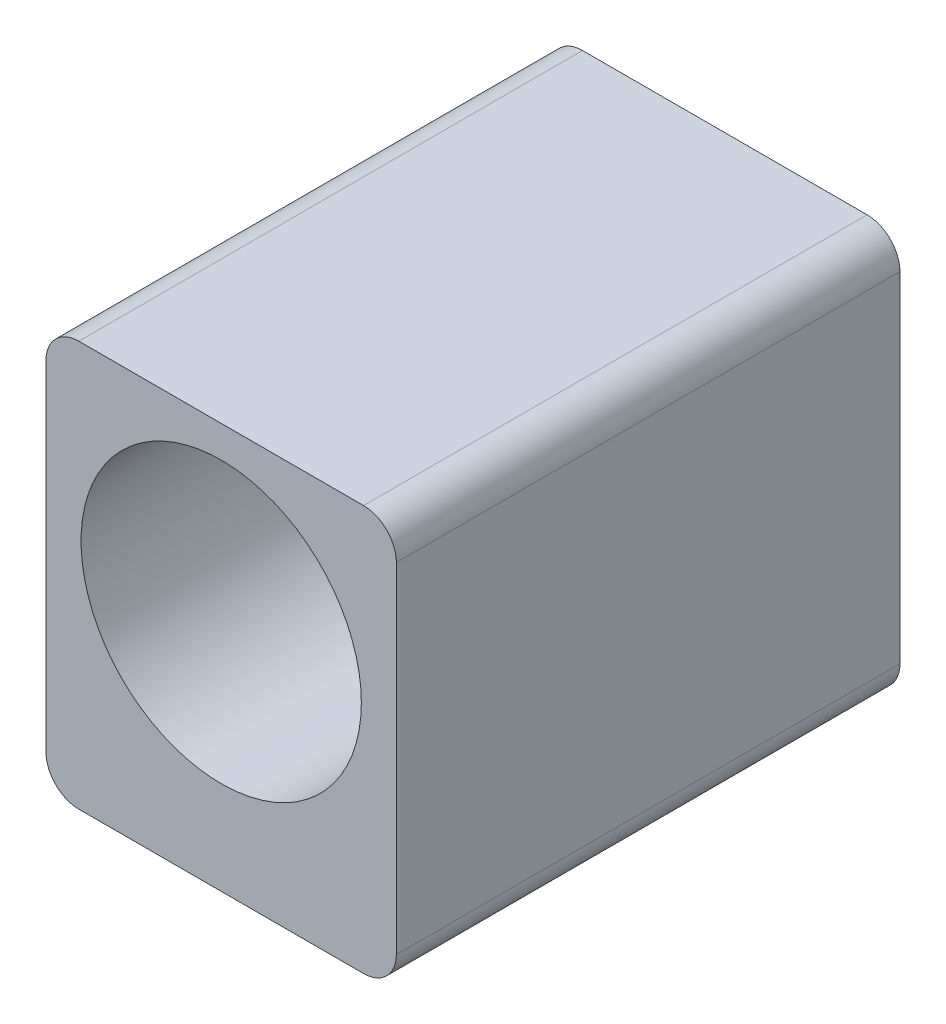
ISO-10303-21;
HEADER;
FILE_DESCRIPTION(('STEP AP214'),'2;1');
FILE_NAME('part.step','',(''),(''),'','','');
FILE_SCHEMA(('AUTOMOTIVE_DESIGN { 1 0 10303 214 1 1 1 1 }'));
ENDSEC;
DATA;
#1=APPLICATION_CONTEXT('core data for automotive mechanical design processes');
#2=APPLICATION_PROTOCOL_DEFINITION('international standard','automotive_design',2000,#1);
#3=PRODUCT_CONTEXT('',#1,'mechanical');
#4=PRODUCT('Part','Part','',(#3));
#5=PRODUCT_RELATED_PRODUCT_CATEGORY('part','',(#4));
#6=PRODUCT_DEFINITION_FORMATION('','',#4);
#7=PRODUCT_DEFINITION_CONTEXT('part definition',#1,'design');
#8=PRODUCT_DEFINITION('design','',#6,#7);
#9=PRODUCT_DEFINITION_SHAPE('','',#8);
#10=(LENGTH_UNIT() NAMED_UNIT(*) SI_UNIT(.MILLI.,.METRE.));
#11=(NAMED_UNIT(*) PLANE_ANGLE_UNIT() SI_UNIT($,.RADIAN.));
#12=(NAMED_UNIT(*) SI_UNIT($,.STERADIAN.) SOLID_ANGLE_UNIT());
#13=UNCERTAINTY_MEASURE_WITH_UNIT(LENGTH_MEASURE(1.E-05),#10,'distance_accuracy_value','');
#14=(GEOMETRIC_REPRESENTATION_CONTEXT(3) GLOBAL_UNCERTAINTY_ASSIGNED_CONTEXT((#13)) GLOBAL_UNIT_ASSIGNED_CONTEXT((#10,
#11,#12)) REPRESENTATION_CONTEXT('',''));
#15=CARTESIAN_POINT('',(0.,0.,0.));
#16=DIRECTION('',(0.,0.,1.));
#17=DIRECTION('',(1.,0.,0.));
#18=AXIS2_PLACEMENT_3D('',#15,#16,#17);
#19=CARTESIAN_POINT('',(-13.,-18.319,23.));
#20=DIRECTION('',(0.,0.,-1.));
#21=DIRECTION('',(-1.,0.,0.));
#22=AXIS2_PLACEMENT_3D('',#19,#20,#21);
#23=CYLINDRICAL_SURFACE('',#22,3.);
#24=CARTESIAN_POINT('',(-13.,-21.319,-15.7679491924311));
#25=CARTESIAN_POINT('',(-13.0476495419929,-21.319003246879,-15.7954566866554));
#26=CARTESIAN_POINT('',(-13.0941261367706,-21.3178644153685,-15.8249157263393));
#27=CARTESIAN_POINT('',(-13.1844127345255,-21.3136667729227,-15.887492356479));
#28=CARTESIAN_POINT('',(-13.2282244852853,-21.3106092356276,-15.9206075079945));
#29=CARTESIAN_POINT('',(-13.354971994891,-21.2991289054113,-16.0248805220334));
#30=CARTESIAN_POINT('',(-13.4335644856848,-21.2883931901029,-16.1011657594107));
#31=CARTESIAN_POINT('',(-13.5768998394832,-21.2639082719283,-16.2649958822506));
#32=CARTESIAN_POINT('',(-13.641668387287,-21.250164755528,-16.3525193936037));
#33=CARTESIAN_POINT('',(-13.7562389302473,-21.2227178611149,-16.5369769090204));
#34=CARTESIAN_POINT('',(-13.8060301014096,-21.2090145191842,-16.633917652206));
#35=CARTESIAN_POINT('',(-13.8910629780802,-21.1839728605559,-16.8391498105373));
#36=CARTESIAN_POINT('',(-13.9256094605519,-21.1727573558681,-16.9477463151311));
#37=CARTESIAN_POINT('',(-13.9757945271664,-21.1559950421372,-17.1696173248816));
#38=CARTESIAN_POINT('',(-13.9914448364848,-21.1504447181504,-17.2828888839642));
#39=CARTESIAN_POINT('',(-14.0029639822057,-21.146383235086,-17.5056348392102));
#40=CARTESIAN_POINT('',(-13.999659217434,-21.1475779698607,-17.6150615404273));
#41=CARTESIAN_POINT('',(-13.9753162540335,-21.1560616133414,-17.8316710432726));
#42=CARTESIAN_POINT('',(-13.9542775064692,-21.1633507106914,-17.9388537753359));
#43=CARTESIAN_POINT('',(-13.8958183231178,-21.1822885845804,-18.145934761301));
#44=CARTESIAN_POINT('',(-13.8587245744734,-21.1938497797202,-18.2459341696921));
#45=CARTESIAN_POINT('',(-13.7692513439552,-21.2190696496689,-18.4386401815987));
#46=CARTESIAN_POINT('',(-13.7168589366862,-21.2327300934301,-18.5313405339215));
#47=CARTESIAN_POINT('',(-13.5946245265132,-21.2601843484393,-18.7123427309295));
#48=CARTESIAN_POINT('',(-13.5239601372463,-21.273941628559,-18.8000953033822));
#49=CARTESIAN_POINT('',(-13.3686421667565,-21.2972920015662,-18.9626663833322));
#50=CARTESIAN_POINT('',(-13.2840209392891,-21.3068945433787,-19.0375140040651));
#51=CARTESIAN_POINT('',(-13.162652445956,-21.3147496086829,-19.1278026107539));
#52=CARTESIAN_POINT('',(-13.1309719735022,-21.3163143003361,-19.1499699645611));
#53=CARTESIAN_POINT('',(-13.0663859430122,-21.3184389764101,-19.1924271085756));
#54=CARTESIAN_POINT('',(-13.0334815120283,-21.3189998628735,-19.212718568935));
#55=CARTESIAN_POINT('',(-13.,-21.319,-19.2320508075689));
#56=B_SPLINE_CURVE_WITH_KNOTS('',3,(#24,#25,#26,#27,#28,#29,#30,#31,#32,#33,#34,#35,#36,#37,#38,
#39,#40,#41,#42,#43,#44,#45,#46,#47,#48,#49,#50,#51,#52,#53,#54,#55),.UNSPECIFIED.,.F.,.F.,(4,2,
2,2,2,2,2,2,2,2,2,2,2,2,2,4),(0.,0.164928355044265,0.329747346002017,0.658207068340202,
0.986051097141595,1.31413148930953,1.65592666310572,1.9975096420087,2.32431683994227,
2.65113415419674,2.97159288998393,3.29232315937776,3.63127871423117,3.96945929389357,
4.08549092620192,4.20141823735249),.UNSPECIFIED.);
#57=CARTESIAN_POINT('',(-13.,-21.319,-15.7679491924311));
#58=VERTEX_POINT('',#57);
#59=CARTESIAN_POINT('',(-13.,-21.319,-19.2320508075689));
#60=VERTEX_POINT('',#59);
#61=EDGE_CURVE('E52',#58,#60,#56,.T.);
#62=ORIENTED_EDGE('',*,*,#61,.F.);
#63=DIRECTION('',(0.,0.,-1.));
#64=VECTOR('',#63,1.);
#65=CARTESIAN_POINT('',(-13.,-21.319,23.));
#66=LINE('',#65,#64);
#67=CARTESIAN_POINT('',(-13.,-21.319,23.));
#68=VERTEX_POINT('',#67);
#69=EDGE_CURVE('E116',#68,#58,#66,.T.);
#70=ORIENTED_EDGE('',*,*,#69,.F.);
#71=CARTESIAN_POINT('',(-13.,-18.319,23.));
#72=DIRECTION('',(0.,0.,1.));
#73=DIRECTION('',(1.,0.,0.));
#74=AXIS2_PLACEMENT_3D('',#71,#72,#73);
#75=CIRCLE('',#74,3.);
#76=CARTESIAN_POINT('',(-16.,-18.319,23.));
#77=VERTEX_POINT('',#76);
#78=EDGE_CURVE('E173',#77,#68,#75,.T.);
#79=ORIENTED_EDGE('',*,*,#78,.F.);
#80=DIRECTION('',(0.,0.,-1.));
#81=VECTOR('',#80,1.);
#82=CARTESIAN_POINT('',(-16.,-18.319,23.));
#83=LINE('',#82,#81);
#84=CARTESIAN_POINT('',(-16.,-18.319,-23.));
#85=VERTEX_POINT('',#84);
#86=EDGE_CURVE('E190',#77,#85,#83,.T.);
#87=ORIENTED_EDGE('',*,*,#86,.T.);
#88=CARTESIAN_POINT('',(-13.,-18.319,-23.));
#89=DIRECTION('',(0.,0.,1.));
#90=DIRECTION('',(1.,0.,0.));
#91=AXIS2_PLACEMENT_3D('',#88,#89,#90);
#92=CIRCLE('',#91,3.);
#93=CARTESIAN_POINT('',(-13.,-21.319,-23.));
#94=VERTEX_POINT('',#93);
#95=EDGE_CURVE('E170',#85,#94,#92,.T.);
#96=ORIENTED_EDGE('',*,*,#95,.T.);
#97=EDGE_CURVE('E130',#60,#94,#66,.T.);
#98=ORIENTED_EDGE('',*,*,#97,.F.);
#99=EDGE_LOOP('',(#62,#70,#79,#87,#96,#98));
#100=FACE_BOUND('',#99,.T.);
#101=ADVANCED_FACE('F39',(#100),#23,.T.);
#102=CARTESIAN_POINT('',(13.,-18.319,23.));
#103=DIRECTION('',(0.,0.,-1.));
#104=DIRECTION('',(-1.,0.,0.));
#105=AXIS2_PLACEMENT_3D('',#102,#103,#104);
#106=CYLINDRICAL_SURFACE('',#105,3.);
#107=CARTESIAN_POINT('',(13.,-21.319,15.7679491924311));
#108=CARTESIAN_POINT('',(13.0476495419929,-21.319003246879,15.7954566866554));
#109=CARTESIAN_POINT('',(13.0941261367706,-21.3178644153685,15.8249157263393));
#110=CARTESIAN_POINT('',(13.1844127345255,-21.3136667729227,15.887492356479));
#111=CARTESIAN_POINT('',(13.2282244852853,-21.3106092356276,15.9206075079945));
#112=CARTESIAN_POINT('',(13.354971994891,-21.2991289054113,16.0248805220334));
#113=CARTESIAN_POINT('',(13.4335644856848,-21.2883931901029,16.1011657594107));
#114=CARTESIAN_POINT('',(13.5768998394832,-21.2639082719283,16.2649958822506));
#115=CARTESIAN_POINT('',(13.641668387287,-21.250164755528,16.3525193936037));
#116=CARTESIAN_POINT('',(13.7562389302473,-21.2227178611149,16.5369769090204));
#117=CARTESIAN_POINT('',(13.8060301014096,-21.2090145191842,16.633917652206));
#118=CARTESIAN_POINT('',(13.8910629780802,-21.1839728605559,16.8391498105373));
#119=CARTESIAN_POINT('',(13.9256094605519,-21.1727573558681,16.9477463151311));
#120=CARTESIAN_POINT('',(13.9757945271664,-21.1559950421372,17.1696173248816));
#121=CARTESIAN_POINT('',(13.9914448364848,-21.1504447181504,17.2828888839642));
#122=CARTESIAN_POINT('',(14.0029639822057,-21.146383235086,17.5056348392102));
#123=CARTESIAN_POINT('',(13.999659217434,-21.1475779698607,17.6150615404273));
#124=CARTESIAN_POINT('',(13.9753162540335,-21.1560616133414,17.8316710432726));
#125=CARTESIAN_POINT('',(13.9542775064692,-21.1633507106914,17.9388537753359));
#126=CARTESIAN_POINT('',(13.8958183231178,-21.1822885845804,18.145934761301));
#127=CARTESIAN_POINT('',(13.8587245744734,-21.1938497797202,18.2459341696921));
#128=CARTESIAN_POINT('',(13.7692513439552,-21.2190696496689,18.4386401815987));
#129=CARTESIAN_POINT('',(13.7168589366862,-21.2327300934301,18.5313405339215));
#130=CARTESIAN_POINT('',(13.5946245265132,-21.2601843484393,18.7123427309295));
#131=CARTESIAN_POINT('',(13.5239601372463,-21.273941628559,18.8000953033822));
#132=CARTESIAN_POINT('',(13.3686421667565,-21.2972920015662,18.9626663833322));
#133=CARTESIAN_POINT('',(13.2840209392891,-21.3068945433787,19.0375140040651));
#134=CARTESIAN_POINT('',(13.162652445956,-21.3147496086829,19.1278026107539));
#135=CARTESIAN_POINT('',(13.1309719735022,-21.3163143003361,19.1499699645611));
#136=CARTESIAN_POINT('',(13.0663859430122,-21.3184389764101,19.1924271085756));
#137=CARTESIAN_POINT('',(13.0334815120283,-21.3189998628735,19.212718568935));
#138=CARTESIAN_POINT('',(13.,-21.319,19.2320508075689));
#139=B_SPLINE_CURVE_WITH_KNOTS('',3,(#107,#108,#109,#110,#111,#112,#113,#114,#115,#116,#117,
#118,#119,#120,#121,#122,#123,#124,#125,#126,#127,#128,#129,#130,#131,#132,#133,#134,#135,#136,
#137,#138),.UNSPECIFIED.,.F.,.F.,(4,2,2,2,2,2,2,2,2,2,2,2,2,2,2,4),(0.,0.164928355044265,
0.329747346002017,0.658207068340202,0.986051097141595,1.31413148930953,1.65592666310572,
1.9975096420087,2.32431683994227,2.65113415419674,2.97159288998393,3.29232315937776,
3.63127871423117,3.96945929389357,4.08549092620192,4.20141823735249),.UNSPECIFIED.);
#140=CARTESIAN_POINT('',(13.,-21.319,15.7679491924311));
#141=VERTEX_POINT('',#140);
#142=CARTESIAN_POINT('',(13.,-21.319,19.2320508075689));
#143=VERTEX_POINT('',#142);
#144=EDGE_CURVE('E47',#141,#143,#139,.T.);
#145=ORIENTED_EDGE('',*,*,#144,.F.);
#146=DIRECTION('',(0.,0.,-1.));
#147=VECTOR('',#146,1.);
#148=CARTESIAN_POINT('',(13.,-21.319,23.));
#149=LINE('',#148,#147);
#150=CARTESIAN_POINT('',(13.,-21.319,-23.));
#151=VERTEX_POINT('',#150);
#152=EDGE_CURVE('E123',#141,#151,#149,.T.);
#153=ORIENTED_EDGE('',*,*,#152,.T.);
#154=CARTESIAN_POINT('',(13.,-18.319,-23.));
#155=DIRECTION('',(0.,0.,1.));
#156=DIRECTION('',(1.,0.,0.));
#157=AXIS2_PLACEMENT_3D('',#154,#155,#156);
#158=CIRCLE('',#157,3.);
#159=CARTESIAN_POINT('',(16.,-18.319,-23.));
#160=VERTEX_POINT('',#159);
#161=EDGE_CURVE('E195',#151,#160,#158,.T.);
#162=ORIENTED_EDGE('',*,*,#161,.T.);
#163=DIRECTION('',(0.,0.,-1.));
#164=VECTOR('',#163,1.);
#165=CARTESIAN_POINT('',(16.,-18.319,23.));
#166=LINE('',#165,#164);
#167=CARTESIAN_POINT('',(16.,-18.319,23.));
#168=VERTEX_POINT('',#167);
#169=EDGE_CURVE('E133',#168,#160,#166,.T.);
#170=ORIENTED_EDGE('',*,*,#169,.F.);
#171=CARTESIAN_POINT('',(13.,-18.319,23.));
#172=DIRECTION('',(0.,0.,1.));
#173=DIRECTION('',(1.,0.,0.));
#174=AXIS2_PLACEMENT_3D('',#171,#172,#173);
#175=CIRCLE('',#174,3.);
#176=CARTESIAN_POINT('',(13.,-21.319,23.));
#177=VERTEX_POINT('',#176);
#178=EDGE_CURVE('E129',#177,#168,#175,.T.);
#179=ORIENTED_EDGE('',*,*,#178,.F.);
#180=EDGE_CURVE('E120',#177,#143,#149,.T.);
#181=ORIENTED_EDGE('',*,*,#180,.T.);
#182=EDGE_LOOP('',(#145,#153,#162,#170,#179,#181));
#183=FACE_BOUND('',#182,.T.);
#184=ADVANCED_FACE('F127',(#183),#106,.T.);
#185=CARTESIAN_POINT('',(-13.,-18.319,23.));
#186=DIRECTION('',(0.,0.,1.));
#187=DIRECTION('',(1.,0.,0.));
#188=AXIS2_PLACEMENT_3D('',#185,#186,#187);
#189=PLANE('',#188);
#190=ORIENTED_EDGE('',*,*,#78,.T.);
#191=DIRECTION('',(1.,0.,0.));
#192=VECTOR('',#191,1.);
#193=CARTESIAN_POINT('',(-13.,-21.319,23.));
#194=LINE('',#193,#192);
#195=EDGE_CURVE('E176',#68,#177,#194,.T.);
#196=ORIENTED_EDGE('',*,*,#195,.T.);
#197=ORIENTED_EDGE('',*,*,#178,.T.);
#198=DIRECTION('',(0.,1.,0.));
#199=VECTOR('',#198,1.);
#200=CARTESIAN_POINT('',(16.,-18.319,23.));
#201=LINE('',#200,#199);
#202=CARTESIAN_POINT('',(16.,12.7,23.));
#203=VERTEX_POINT('',#202);
#204=EDGE_CURVE('E180',#168,#203,#201,.T.);
#205=ORIENTED_EDGE('',*,*,#204,.T.);
#206=CARTESIAN_POINT('',(13.,12.7,23.));
#207=DIRECTION('',(0.,0.,1.));
#208=DIRECTION('',(1.,0.,0.));
#209=AXIS2_PLACEMENT_3D('',#206,#207,#208);
#210=CIRCLE('',#209,3.);
#211=CARTESIAN_POINT('',(13.,15.7,23.));
#212=VERTEX_POINT('',#211);
#213=EDGE_CURVE('E182',#203,#212,#210,.T.);
#214=ORIENTED_EDGE('',*,*,#213,.T.);
#215=DIRECTION('',(-1.,0.,0.));
#216=VECTOR('',#215,1.);
#217=CARTESIAN_POINT('',(13.,15.7,23.));
#218=LINE('',#217,#216);
#219=CARTESIAN_POINT('',(-13.,15.7,23.));
#220=VERTEX_POINT('',#219);
#221=EDGE_CURVE('E184',#212,#220,#218,.T.);
#222=ORIENTED_EDGE('',*,*,#221,.T.);
#223=CARTESIAN_POINT('',(-13.,12.7,23.));
#224=DIRECTION('',(0.,0.,1.));
#225=DIRECTION('',(1.,0.,0.));
#226=AXIS2_PLACEMENT_3D('',#223,#224,#225);
#227=CIRCLE('',#226,3.);
#228=CARTESIAN_POINT('',(-16.,12.7,23.));
#229=VERTEX_POINT('',#228);
#230=EDGE_CURVE('E186',#220,#229,#227,.T.);
#231=ORIENTED_EDGE('',*,*,#230,.T.);
#232=DIRECTION('',(0.,-1.,0.));
#233=VECTOR('',#232,1.);
#234=CARTESIAN_POINT('',(-16.,12.7,23.));
#235=LINE('',#234,#233);
#236=EDGE_CURVE('E188',#229,#77,#235,.T.);
#237=ORIENTED_EDGE('',*,*,#236,.T.);
#238=EDGE_LOOP('',(#190,#196,#197,#205,#214,#222,#231,#237));
#239=FACE_BOUND('',#238,.T.);
#240=CARTESIAN_POINT('',(0.,0.,23.));
#241=DIRECTION('',(0.,0.,1.));
#242=DIRECTION('',(1.,0.,0.));
#243=AXIS2_PLACEMENT_3D('',#240,#241,#242);
#244=CIRCLE('',#243,12.8);
#245=CARTESIAN_POINT('',(12.8,0.,23.));
#246=VERTEX_POINT('',#245);
#247=EDGE_CURVE('E167',#246,#246,#244,.T.);
#248=ORIENTED_EDGE('',*,*,#247,.F.);
#249=EDGE_LOOP('',(#248));
#250=FACE_BOUND('',#249,.T.);
#251=ADVANCED_FACE('F243',(#239,#250),#189,.T.);
#252=CARTESIAN_POINT('',(-13.,-18.319,-23.));
#253=DIRECTION('',(0.,0.,1.));
#254=DIRECTION('',(1.,0.,0.));
#255=AXIS2_PLACEMENT_3D('',#252,#253,#254);
#256=PLANE('',#255);
#257=ORIENTED_EDGE('',*,*,#95,.F.);
#258=DIRECTION('',(0.,-1.,0.));
#259=VECTOR('',#258,1.);
#260=CARTESIAN_POINT('',(-16.,12.7,-23.));
#261=LINE('',#260,#259);
#262=CARTESIAN_POINT('',(-16.,12.7,-23.));
#263=VERTEX_POINT('',#262);
#264=EDGE_CURVE('E177',#263,#85,#261,.T.);
#265=ORIENTED_EDGE('',*,*,#264,.F.);
#266=CARTESIAN_POINT('',(-13.,12.7,-23.));
#267=DIRECTION('',(0.,0.,1.));
#268=DIRECTION('',(1.,0.,0.));
#269=AXIS2_PLACEMENT_3D('',#266,#267,#268);
#270=CIRCLE('',#269,3.);
#271=CARTESIAN_POINT('',(-13.,15.7,-23.));
#272=VERTEX_POINT('',#271);
#273=EDGE_CURVE('E203',#272,#263,#270,.T.);
#274=ORIENTED_EDGE('',*,*,#273,.F.);
#275=DIRECTION('',(-1.,0.,0.));
#276=VECTOR('',#275,1.);
#277=CARTESIAN_POINT('',(13.,15.7,-23.));
#278=LINE('',#277,#276);
#279=CARTESIAN_POINT('',(13.,15.7,-23.));
#280=VERTEX_POINT('',#279);
#281=EDGE_CURVE('E201',#280,#272,#278,.T.);
#282=ORIENTED_EDGE('',*,*,#281,.F.);
#283=CARTESIAN_POINT('',(13.,12.7,-23.));
#284=DIRECTION('',(0.,0.,1.));
#285=DIRECTION('',(1.,0.,0.));
#286=AXIS2_PLACEMENT_3D('',#283,#284,#285);
#287=CIRCLE('',#286,3.);
#288=CARTESIAN_POINT('',(16.,12.7,-23.));
#289=VERTEX_POINT('',#288);
#290=EDGE_CURVE('E199',#289,#280,#287,.T.);
#291=ORIENTED_EDGE('',*,*,#290,.F.);
#292=DIRECTION('',(0.,1.,0.));
#293=VECTOR('',#292,1.);
#294=CARTESIAN_POINT('',(16.,-18.319,-23.));
#295=LINE('',#294,#293);
#296=EDGE_CURVE('E197',#160,#289,#295,.T.);
#297=ORIENTED_EDGE('',*,*,#296,.F.);
#298=ORIENTED_EDGE('',*,*,#161,.F.);
#299=DIRECTION('',(1.,0.,0.));
#300=VECTOR('',#299,1.);
#301=CARTESIAN_POINT('',(-13.,-21.319,-23.));
#302=LINE('',#301,#300);
#303=EDGE_CURVE('E193',#94,#151,#302,.T.);
#304=ORIENTED_EDGE('',*,*,#303,.F.);
#305=EDGE_LOOP('',(#257,#265,#274,#282,#291,#297,#298,#304));
#306=FACE_BOUND('',#305,.T.);
#307=CARTESIAN_POINT('',(0.,0.,-23.));
#308=DIRECTION('',(0.,0.,1.));
#309=DIRECTION('',(1.,0.,0.));
#310=AXIS2_PLACEMENT_3D('',#307,#308,#309);
#311=CIRCLE('',#310,12.8);
#312=CARTESIAN_POINT('',(12.8,0.,-23.));
#313=VERTEX_POINT('',#312);
#314=EDGE_CURVE('E166',#313,#313,#311,.T.);
#315=ORIENTED_EDGE('',*,*,#314,.T.);
#316=EDGE_LOOP('',(#315));
#317=FACE_BOUND('',#316,.T.);
#318=ADVANCED_FACE('F230',(#306,#317),#256,.F.);
#319=CARTESIAN_POINT('',(-13.,-21.319,23.));
#320=DIRECTION('',(0.,1.,0.));
#321=DIRECTION('',(0.,0.,1.));
#322=AXIS2_PLACEMENT_3D('',#319,#320,#321);
#323=PLANE('',#322);
#324=CARTESIAN_POINT('',(12.,-21.319,17.5));
#325=DIRECTION('',(0.,1.,0.));
#326=DIRECTION('',(0.,0.,1.));
#327=AXIS2_PLACEMENT_3D('',#324,#325,#326);
#328=CIRCLE('',#327,2.);
#329=EDGE_CURVE('E59',#141,#143,#328,.T.);
#330=ORIENTED_EDGE('',*,*,#329,.T.);
#331=ORIENTED_EDGE('',*,*,#180,.F.);
#332=ORIENTED_EDGE('',*,*,#195,.F.);
#333=ORIENTED_EDGE('',*,*,#69,.T.);
#334=CARTESIAN_POINT('',(-12.,-21.319,-17.5));
#335=DIRECTION('',(0.,1.,0.));
#336=DIRECTION('',(0.,0.,1.));
#337=AXIS2_PLACEMENT_3D('',#334,#335,#336);
#338=CIRCLE('',#337,2.);
#339=EDGE_CURVE('E11',#60,#58,#338,.F.);
#340=ORIENTED_EDGE('',*,*,#339,.F.);
#341=ORIENTED_EDGE('',*,*,#97,.T.);
#342=ORIENTED_EDGE('',*,*,#303,.T.);
#343=ORIENTED_EDGE('',*,*,#152,.F.);
#344=EDGE_LOOP('',(#330,#331,#332,#333,#340,#341,#342,#343));
#345=FACE_BOUND('',#344,.T.);
#346=ADVANCED_FACE('F119',(#345),#323,.F.);
#347=CARTESIAN_POINT('',(16.,-18.319,23.));
#348=DIRECTION('',(-1.,0.,0.));
#349=DIRECTION('',(0.,0.,1.));
#350=AXIS2_PLACEMENT_3D('',#347,#348,#349);
#351=PLANE('',#350);
#352=ORIENTED_EDGE('',*,*,#296,.T.);
#353=DIRECTION('',(0.,0.,-1.));
#354=VECTOR('',#353,1.);
#355=CARTESIAN_POINT('',(16.,12.7,23.));
#356=LINE('',#355,#354);
#357=EDGE_CURVE('E216',#203,#289,#356,.T.);
#358=ORIENTED_EDGE('',*,*,#357,.F.);
#359=ORIENTED_EDGE('',*,*,#204,.F.);
#360=ORIENTED_EDGE('',*,*,#169,.T.);
#361=EDGE_LOOP('',(#352,#358,#359,#360));
#362=FACE_BOUND('',#361,.T.);
#363=ADVANCED_FACE('F226',(#362),#351,.F.);
#364=CARTESIAN_POINT('',(13.,12.7,23.));
#365=DIRECTION('',(0.,0.,-1.));
#366=DIRECTION('',(-1.,0.,0.));
#367=AXIS2_PLACEMENT_3D('',#364,#365,#366);
#368=CYLINDRICAL_SURFACE('',#367,3.);
#369=ORIENTED_EDGE('',*,*,#290,.T.);
#370=DIRECTION('',(0.,0.,-1.));
#371=VECTOR('',#370,1.);
#372=CARTESIAN_POINT('',(13.,15.7,23.));
#373=LINE('',#372,#371);
#374=EDGE_CURVE('E214',#212,#280,#373,.T.);
#375=ORIENTED_EDGE('',*,*,#374,.F.);
#376=ORIENTED_EDGE('',*,*,#213,.F.);
#377=ORIENTED_EDGE('',*,*,#357,.T.);
#378=EDGE_LOOP('',(#369,#375,#376,#377));
#379=FACE_BOUND('',#378,.T.);
#380=ADVANCED_FACE('F236',(#379),#368,.T.);
#381=CARTESIAN_POINT('',(13.,15.7,23.));
#382=DIRECTION('',(0.,-1.,0.));
#383=DIRECTION('',(0.,0.,-1.));
#384=AXIS2_PLACEMENT_3D('',#381,#382,#383);
#385=PLANE('',#384);
#386=ORIENTED_EDGE('',*,*,#281,.T.);
#387=DIRECTION('',(0.,0.,-1.));
#388=VECTOR('',#387,1.);
#389=CARTESIAN_POINT('',(-13.,15.7,23.));
#390=LINE('',#389,#388);
#391=EDGE_CURVE('E211',#220,#272,#390,.T.);
#392=ORIENTED_EDGE('',*,*,#391,.F.);
#393=ORIENTED_EDGE('',*,*,#221,.F.);
#394=ORIENTED_EDGE('',*,*,#374,.T.);
#395=EDGE_LOOP('',(#386,#392,#393,#394));
#396=FACE_BOUND('',#395,.T.);
#397=ADVANCED_FACE('F239',(#396),#385,.F.);
#398=CARTESIAN_POINT('',(-13.,12.7,23.));
#399=DIRECTION('',(0.,0.,-1.));
#400=DIRECTION('',(-1.,0.,0.));
#401=AXIS2_PLACEMENT_3D('',#398,#399,#400);
#402=CYLINDRICAL_SURFACE('',#401,3.);
#403=ORIENTED_EDGE('',*,*,#273,.T.);
#404=DIRECTION('',(0.,0.,-1.));
#405=VECTOR('',#404,1.);
#406=CARTESIAN_POINT('',(-16.,12.7,23.));
#407=LINE('',#406,#405);
#408=EDGE_CURVE('E208',#229,#263,#407,.T.);
#409=ORIENTED_EDGE('',*,*,#408,.F.);
#410=ORIENTED_EDGE('',*,*,#230,.F.);
#411=ORIENTED_EDGE('',*,*,#391,.T.);
#412=EDGE_LOOP('',(#403,#409,#410,#411));
#413=FACE_BOUND('',#412,.T.);
#414=ADVANCED_FACE('F256',(#413),#402,.T.);
#415=CARTESIAN_POINT('',(-16.,12.7,23.));
#416=DIRECTION('',(1.,0.,0.));
#417=DIRECTION('',(0.,0.,-1.));
#418=AXIS2_PLACEMENT_3D('',#415,#416,#417);
#419=PLANE('',#418);
#420=ORIENTED_EDGE('',*,*,#264,.T.);
#421=ORIENTED_EDGE('',*,*,#86,.F.);
#422=ORIENTED_EDGE('',*,*,#236,.F.);
#423=ORIENTED_EDGE('',*,*,#408,.T.);
#424=EDGE_LOOP('',(#420,#421,#422,#423));
#425=FACE_BOUND('',#424,.T.);
#426=ADVANCED_FACE('F253',(#425),#419,.F.);
#427=CARTESIAN_POINT('',(0.,0.,23.));
#428=DIRECTION('',(0.,0.,-1.));
#429=DIRECTION('',(-1.,0.,0.));
#430=AXIS2_PLACEMENT_3D('',#427,#428,#429);
#431=CYLINDRICAL_SURFACE('',#430,12.8);
#432=ORIENTED_EDGE('',*,*,#247,.T.);
#433=EDGE_LOOP('',(#432));
#434=FACE_BOUND('',#433,.T.);
#435=ORIENTED_EDGE('',*,*,#314,.F.);
#436=EDGE_LOOP('',(#435));
#437=FACE_BOUND('',#436,.T.);
#438=ADVANCED_FACE('F150',(#434,#437),#431,.F.);
#439=CARTESIAN_POINT('',(12.,-13.819,17.5));
#440=DIRECTION('',(0.,-1.,0.));
#441=DIRECTION('',(0.,0.,-1.));
#442=AXIS2_PLACEMENT_3D('',#439,#440,#441);
#443=CYLINDRICAL_SURFACE('',#442,2.);
#444=CARTESIAN_POINT('',(12.,-13.819,17.5));
#445=DIRECTION('',(0.,1.,0.));
#446=DIRECTION('',(0.,0.,1.));
#447=AXIS2_PLACEMENT_3D('',#444,#445,#446);
#448=CIRCLE('',#447,2.);
#449=CARTESIAN_POINT('',(12.,-13.819,19.5));
#450=VERTEX_POINT('',#449);
#451=EDGE_CURVE('E124',#450,#450,#448,.T.);
#452=ORIENTED_EDGE('',*,*,#451,.T.);
#453=EDGE_LOOP('',(#452));
#454=FACE_BOUND('',#453,.T.);
#455=ORIENTED_EDGE('',*,*,#144,.T.);
#456=ORIENTED_EDGE('',*,*,#329,.F.);
#457=EDGE_LOOP('',(#455,#456));
#458=FACE_BOUND('',#457,.T.);
#459=ADVANCED_FACE('F112',(#454,#458),#443,.F.);
#460=CARTESIAN_POINT('',(12.,-13.819,17.5));
#461=DIRECTION('',(0.,1.,0.));
#462=DIRECTION('',(0.,0.,1.));
#463=AXIS2_PLACEMENT_3D('',#460,#461,#462);
#464=PLANE('',#463);
#465=ORIENTED_EDGE('',*,*,#451,.F.);
#466=EDGE_LOOP('',(#465));
#467=FACE_BOUND('',#466,.T.);
#468=ADVANCED_FACE('F149',(#467),#464,.F.);
#469=CARTESIAN_POINT('',(-12.,-13.819,-17.5));
#470=DIRECTION('',(0.,-1.,0.));
#471=DIRECTION('',(0.,0.,-1.));
#472=AXIS2_PLACEMENT_3D('',#469,#470,#471);
#473=CYLINDRICAL_SURFACE('',#472,2.);
#474=CARTESIAN_POINT('',(-12.,-13.819,-17.5));
#475=DIRECTION('',(0.,1.,0.));
#476=DIRECTION('',(0.,0.,1.));
#477=AXIS2_PLACEMENT_3D('',#474,#475,#476);
#478=CIRCLE('',#477,2.);
#479=CARTESIAN_POINT('',(-12.,-13.819,-15.5));
#480=VERTEX_POINT('',#479);
#481=EDGE_CURVE('E125',#480,#480,#478,.T.);
#482=ORIENTED_EDGE('',*,*,#481,.T.);
#483=EDGE_LOOP('',(#482));
#484=FACE_BOUND('',#483,.T.);
#485=ORIENTED_EDGE('',*,*,#61,.T.);
#486=ORIENTED_EDGE('',*,*,#339,.T.);
#487=EDGE_LOOP('',(#485,#486));
#488=FACE_BOUND('',#487,.T.);
#489=ADVANCED_FACE('F152',(#484,#488),#473,.F.);
#490=CARTESIAN_POINT('',(-12.,-13.819,-17.5));
#491=DIRECTION('',(0.,1.,0.));
#492=DIRECTION('',(0.,0.,1.));
#493=AXIS2_PLACEMENT_3D('',#490,#491,#492);
#494=PLANE('',#493);
#495=ORIENTED_EDGE('',*,*,#481,.F.);
#496=EDGE_LOOP('',(#495));
#497=FACE_BOUND('',#496,.T.);
#498=ADVANCED_FACE('F156',(#497),#494,.F.);
#499=CLOSED_SHELL('',(#101,#184,#251,#318,#346,#363,#380,#397,#414,#426,#438,#459,#468,#489,#498));
#500=MANIFOLD_SOLID_BREP('B2',#499);
#501=ADVANCED_BREP_SHAPE_REPRESENTATION('',(#18,#500),#14);
#502=SHAPE_DEFINITION_REPRESENTATION(#9,#501);
ENDSEC;
END-ISO-10303-21;
